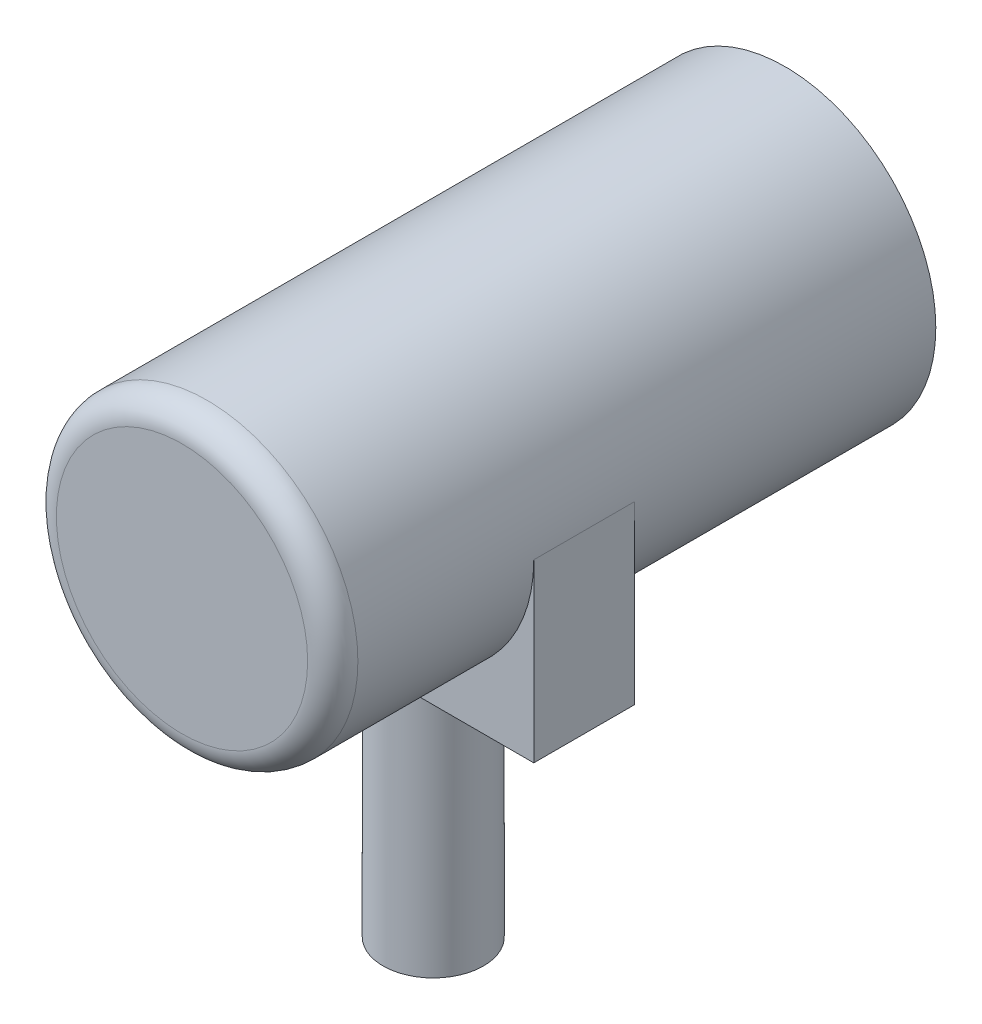
ISO-10303-21;
HEADER;
FILE_DESCRIPTION(('STEP AP214'),'2;1');
FILE_NAME('part.step','',(''),(''),'','','');
FILE_SCHEMA(('AUTOMOTIVE_DESIGN { 1 0 10303 214 1 1 1 1 }'));
ENDSEC;
DATA;
#1=APPLICATION_CONTEXT('core data for automotive mechanical design processes');
#2=APPLICATION_PROTOCOL_DEFINITION('international standard','automotive_design',2000,#1);
#3=PRODUCT_CONTEXT('',#1,'mechanical');
#4=PRODUCT('Part','Part','',(#3));
#5=PRODUCT_RELATED_PRODUCT_CATEGORY('part','',(#4));
#6=PRODUCT_DEFINITION_FORMATION('','',#4);
#7=PRODUCT_DEFINITION_CONTEXT('part definition',#1,'design');
#8=PRODUCT_DEFINITION('design','',#6,#7);
#9=PRODUCT_DEFINITION_SHAPE('','',#8);
#10=(LENGTH_UNIT() NAMED_UNIT(*) SI_UNIT(.MILLI.,.METRE.));
#11=(NAMED_UNIT(*) PLANE_ANGLE_UNIT() SI_UNIT($,.RADIAN.));
#12=(NAMED_UNIT(*) SI_UNIT($,.STERADIAN.) SOLID_ANGLE_UNIT());
#13=UNCERTAINTY_MEASURE_WITH_UNIT(LENGTH_MEASURE(1.E-05),#10,'distance_accuracy_value','');
#14=(GEOMETRIC_REPRESENTATION_CONTEXT(3) GLOBAL_UNCERTAINTY_ASSIGNED_CONTEXT((#13)) GLOBAL_UNIT_ASSIGNED_CONTEXT((#10,
#11,#12)) REPRESENTATION_CONTEXT('',''));
#15=CARTESIAN_POINT('',(0.,0.,0.));
#16=DIRECTION('',(0.,0.,1.));
#17=DIRECTION('',(1.,0.,0.));
#18=AXIS2_PLACEMENT_3D('',#15,#16,#17);
#19=CARTESIAN_POINT('',(-30.,-35.,-40.));
#20=DIRECTION('',(0.,1.,0.));
#21=DIRECTION('',(0.,0.,1.));
#22=AXIS2_PLACEMENT_3D('',#19,#20,#21);
#23=PLANE('',#22);
#24=CARTESIAN_POINT('',(0.,-35.,-50.));
#25=DIRECTION('',(0.,-1.,0.));
#26=DIRECTION('',(0.,0.,-1.));
#27=AXIS2_PLACEMENT_3D('',#24,#25,#26);
#28=CIRCLE('',#27,10.);
#29=CARTESIAN_POINT('',(0.,-35.,-60.));
#30=VERTEX_POINT('',#29);
#31=CARTESIAN_POINT('',(0.,-35.,-40.));
#32=VERTEX_POINT('',#31);
#33=EDGE_CURVE('E107',#30,#32,#28,.T.);
#34=ORIENTED_EDGE('',*,*,#33,.F.);
#35=DIRECTION('',(1.,0.,0.));
#36=VECTOR('',#35,1.);
#37=CARTESIAN_POINT('',(-30.,-35.,-60.));
#38=LINE('',#37,#36);
#39=CARTESIAN_POINT('',(30.,-35.,-60.));
#40=VERTEX_POINT('',#39);
#41=EDGE_CURVE('E96',#30,#40,#38,.T.);
#42=ORIENTED_EDGE('',*,*,#41,.T.);
#43=DIRECTION('',(0.,0.,-1.));
#44=VECTOR('',#43,1.);
#45=CARTESIAN_POINT('',(30.,-35.,-40.));
#46=LINE('',#45,#44);
#47=CARTESIAN_POINT('',(30.,-35.,-40.));
#48=VERTEX_POINT('',#47);
#49=EDGE_CURVE('E142',#48,#40,#46,.T.);
#50=ORIENTED_EDGE('',*,*,#49,.F.);
#51=DIRECTION('',(1.,0.,0.));
#52=VECTOR('',#51,1.);
#53=CARTESIAN_POINT('',(-30.,-35.,-40.));
#54=LINE('',#53,#52);
#55=EDGE_CURVE('E108',#32,#48,#54,.T.);
#56=ORIENTED_EDGE('',*,*,#55,.F.);
#57=EDGE_LOOP('',(#34,#42,#50,#56));
#58=FACE_BOUND('',#57,.T.);
#59=ADVANCED_FACE('F41',(#58),#23,.F.);
#60=CARTESIAN_POINT('',(0.,0.,-120.));
#61=DIRECTION('',(0.,0.,1.));
#62=DIRECTION('',(1.,0.,0.));
#63=AXIS2_PLACEMENT_3D('',#60,#61,#62);
#64=CYLINDRICAL_SURFACE('',#63,30.);
#65=CARTESIAN_POINT('',(0.,0.,-5.));
#66=DIRECTION('',(0.,0.,1.));
#67=DIRECTION('',(1.,0.,0.));
#68=AXIS2_PLACEMENT_3D('',#65,#66,#67);
#69=CIRCLE('',#68,30.);
#70=CARTESIAN_POINT('',(30.,0.,-5.));
#71=VERTEX_POINT('',#70);
#72=EDGE_CURVE('E11',#71,#71,#69,.F.);
#73=ORIENTED_EDGE('',*,*,#72,.T.);
#74=EDGE_LOOP('',(#73));
#75=FACE_BOUND('',#74,.T.);
#76=CARTESIAN_POINT('',(0.,0.,-40.));
#77=DIRECTION('',(0.,0.,-1.));
#78=DIRECTION('',(1.,0.,0.));
#79=AXIS2_PLACEMENT_3D('',#76,#77,#78);
#80=CIRCLE('',#79,30.);
#81=CARTESIAN_POINT('',(30.,0.,-40.));
#82=VERTEX_POINT('',#81);
#83=CARTESIAN_POINT('',(-30.,0.,-40.));
#84=VERTEX_POINT('',#83);
#85=EDGE_CURVE('E125',#82,#84,#80,.T.);
#86=ORIENTED_EDGE('',*,*,#85,.F.);
#87=DIRECTION('',(0.,0.,-1.));
#88=VECTOR('',#87,1.);
#89=CARTESIAN_POINT('',(30.,0.,-40.));
#90=LINE('',#89,#88);
#91=CARTESIAN_POINT('',(30.,0.,-60.));
#92=VERTEX_POINT('',#91);
#93=EDGE_CURVE('E134',#82,#92,#90,.T.);
#94=ORIENTED_EDGE('',*,*,#93,.T.);
#95=CARTESIAN_POINT('',(0.,0.,-60.));
#96=DIRECTION('',(0.,0.,-1.));
#97=DIRECTION('',(1.,0.,0.));
#98=AXIS2_PLACEMENT_3D('',#95,#96,#97);
#99=CIRCLE('',#98,30.);
#100=CARTESIAN_POINT('',(-30.,0.,-60.));
#101=VERTEX_POINT('',#100);
#102=EDGE_CURVE('E135',#92,#101,#99,.T.);
#103=ORIENTED_EDGE('',*,*,#102,.T.);
#104=DIRECTION('',(0.,0.,-1.));
#105=VECTOR('',#104,1.);
#106=CARTESIAN_POINT('',(-30.,0.,-40.));
#107=LINE('',#106,#105);
#108=EDGE_CURVE('E65',#84,#101,#107,.T.);
#109=ORIENTED_EDGE('',*,*,#108,.F.);
#110=EDGE_LOOP('',(#86,#94,#103,#109));
#111=FACE_BOUND('',#110,.T.);
#112=CARTESIAN_POINT('',(0.,0.,-120.));
#113=DIRECTION('',(0.,0.,1.));
#114=DIRECTION('',(1.,0.,0.));
#115=AXIS2_PLACEMENT_3D('',#112,#113,#114);
#116=CIRCLE('',#115,30.);
#117=CARTESIAN_POINT('',(30.,0.,-120.));
#118=VERTEX_POINT('',#117);
#119=EDGE_CURVE('E116',#118,#118,#116,.T.);
#120=ORIENTED_EDGE('',*,*,#119,.T.);
#121=EDGE_LOOP('',(#120));
#122=FACE_BOUND('',#121,.T.);
#123=ADVANCED_FACE('F167',(#75,#111,#122),#64,.T.);
#124=CARTESIAN_POINT('',(0.,0.,-120.));
#125=DIRECTION('',(0.,0.,1.));
#126=DIRECTION('',(1.,0.,0.));
#127=AXIS2_PLACEMENT_3D('',#124,#125,#126);
#128=PLANE('',#127);
#129=CARTESIAN_POINT('',(0.,0.,-120.));
#130=DIRECTION('',(0.,0.,1.));
#131=DIRECTION('',(1.,0.,0.));
#132=AXIS2_PLACEMENT_3D('',#129,#130,#131);
#133=CIRCLE('',#132,25.);
#134=CARTESIAN_POINT('',(25.,0.,-120.));
#135=VERTEX_POINT('',#134);
#136=EDGE_CURVE('E120',#135,#135,#133,.T.);
#137=ORIENTED_EDGE('',*,*,#136,.T.);
#138=EDGE_LOOP('',(#137));
#139=FACE_BOUND('',#138,.T.);
#140=ORIENTED_EDGE('',*,*,#119,.F.);
#141=EDGE_LOOP('',(#140));
#142=FACE_BOUND('',#141,.T.);
#143=ADVANCED_FACE('F172',(#139,#142),#128,.F.);
#144=CARTESIAN_POINT('',(0.,0.,0.));
#145=DIRECTION('',(0.,0.,1.));
#146=DIRECTION('',(1.,0.,0.));
#147=AXIS2_PLACEMENT_3D('',#144,#145,#146);
#148=PLANE('',#147);
#149=CARTESIAN_POINT('',(0.,0.,0.));
#150=DIRECTION('',(0.,0.,1.));
#151=DIRECTION('',(1.,0.,0.));
#152=AXIS2_PLACEMENT_3D('',#149,#150,#151);
#153=CIRCLE('',#152,25.);
#154=CARTESIAN_POINT('',(25.,0.,0.));
#155=VERTEX_POINT('',#154);
#156=EDGE_CURVE('E50',#155,#155,#153,.T.);
#157=ORIENTED_EDGE('',*,*,#156,.T.);
#158=EDGE_LOOP('',(#157));
#159=FACE_BOUND('',#158,.T.);
#160=ADVANCED_FACE('F153',(#159),#148,.T.);
#161=CARTESIAN_POINT('',(0.,0.,-120.));
#162=DIRECTION('',(0.,0.,1.));
#163=DIRECTION('',(1.,0.,0.));
#164=AXIS2_PLACEMENT_3D('',#161,#162,#163);
#165=CYLINDRICAL_SURFACE('',#164,25.);
#166=CARTESIAN_POINT('',(0.,0.,-118.));
#167=DIRECTION('',(0.,0.,-1.));
#168=DIRECTION('',(-1.,0.,0.));
#169=AXIS2_PLACEMENT_3D('',#166,#167,#168);
#170=CIRCLE('',#169,25.);
#171=CARTESIAN_POINT('',(-25.,0.,-118.));
#172=VERTEX_POINT('',#171);
#173=EDGE_CURVE('E112',#172,#172,#170,.T.);
#174=ORIENTED_EDGE('',*,*,#173,.F.);
#175=EDGE_LOOP('',(#174));
#176=FACE_BOUND('',#175,.T.);
#177=ORIENTED_EDGE('',*,*,#136,.F.);
#178=EDGE_LOOP('',(#177));
#179=FACE_BOUND('',#178,.T.);
#180=ADVANCED_FACE('F185',(#176,#179),#165,.F.);
#181=CARTESIAN_POINT('',(-30.,0.,-40.));
#182=DIRECTION('',(1.,0.,0.));
#183=DIRECTION('',(0.,1.,0.));
#184=AXIS2_PLACEMENT_3D('',#181,#182,#183);
#185=PLANE('',#184);
#186=DIRECTION('',(0.,-1.,0.));
#187=VECTOR('',#186,1.);
#188=CARTESIAN_POINT('',(-30.,0.,-60.));
#189=LINE('',#188,#187);
#190=CARTESIAN_POINT('',(-30.,-35.,-60.));
#191=VERTEX_POINT('',#190);
#192=EDGE_CURVE('E105',#101,#191,#189,.T.);
#193=ORIENTED_EDGE('',*,*,#192,.T.);
#194=DIRECTION('',(0.,0.,-1.));
#195=VECTOR('',#194,1.);
#196=CARTESIAN_POINT('',(-30.,-35.,-40.));
#197=LINE('',#196,#195);
#198=CARTESIAN_POINT('',(-30.,-35.,-40.));
#199=VERTEX_POINT('',#198);
#200=EDGE_CURVE('E93',#199,#191,#197,.T.);
#201=ORIENTED_EDGE('',*,*,#200,.F.);
#202=DIRECTION('',(0.,-1.,0.));
#203=VECTOR('',#202,1.);
#204=CARTESIAN_POINT('',(-30.,0.,-40.));
#205=LINE('',#204,#203);
#206=EDGE_CURVE('E128',#84,#199,#205,.T.);
#207=ORIENTED_EDGE('',*,*,#206,.F.);
#208=ORIENTED_EDGE('',*,*,#108,.T.);
#209=EDGE_LOOP('',(#193,#201,#207,#208));
#210=FACE_BOUND('',#209,.T.);
#211=ADVANCED_FACE('F178',(#210),#185,.F.);
#212=EDGE_CURVE('E57',#32,#30,#28,.T.);
#213=ORIENTED_EDGE('',*,*,#212,.F.);
#214=EDGE_CURVE('E130',#199,#32,#54,.T.);
#215=ORIENTED_EDGE('',*,*,#214,.F.);
#216=ORIENTED_EDGE('',*,*,#200,.T.);
#217=EDGE_CURVE('E89',#191,#30,#38,.T.);
#218=ORIENTED_EDGE('',*,*,#217,.T.);
#219=EDGE_LOOP('',(#213,#215,#216,#218));
#220=FACE_BOUND('',#219,.T.);
#221=ADVANCED_FACE('F91',(#220),#23,.F.);
#222=CARTESIAN_POINT('',(30.,-35.,-40.));
#223=DIRECTION('',(-1.,0.,0.));
#224=DIRECTION('',(0.,-1.,0.));
#225=AXIS2_PLACEMENT_3D('',#222,#223,#224);
#226=PLANE('',#225);
#227=DIRECTION('',(0.,1.,0.));
#228=VECTOR('',#227,1.);
#229=CARTESIAN_POINT('',(30.,-35.,-60.));
#230=LINE('',#229,#228);
#231=EDGE_CURVE('E95',#40,#92,#230,.T.);
#232=ORIENTED_EDGE('',*,*,#231,.T.);
#233=ORIENTED_EDGE('',*,*,#93,.F.);
#234=DIRECTION('',(0.,1.,0.));
#235=VECTOR('',#234,1.);
#236=CARTESIAN_POINT('',(30.,-35.,-40.));
#237=LINE('',#236,#235);
#238=EDGE_CURVE('E132',#48,#82,#237,.T.);
#239=ORIENTED_EDGE('',*,*,#238,.F.);
#240=ORIENTED_EDGE('',*,*,#49,.T.);
#241=EDGE_LOOP('',(#232,#233,#239,#240));
#242=FACE_BOUND('',#241,.T.);
#243=ADVANCED_FACE('F177',(#242),#226,.F.);
#244=CARTESIAN_POINT('',(0.,0.,-40.));
#245=DIRECTION('',(0.,0.,1.));
#246=DIRECTION('',(1.,0.,0.));
#247=AXIS2_PLACEMENT_3D('',#244,#245,#246);
#248=PLANE('',#247);
#249=ORIENTED_EDGE('',*,*,#85,.T.);
#250=ORIENTED_EDGE('',*,*,#206,.T.);
#251=ORIENTED_EDGE('',*,*,#214,.T.);
#252=ORIENTED_EDGE('',*,*,#55,.T.);
#253=ORIENTED_EDGE('',*,*,#238,.T.);
#254=EDGE_LOOP('',(#249,#250,#251,#252,#253));
#255=FACE_BOUND('',#254,.T.);
#256=ADVANCED_FACE('F183',(#255),#248,.T.);
#257=CARTESIAN_POINT('',(0.,0.,-60.));
#258=DIRECTION('',(0.,0.,1.));
#259=DIRECTION('',(1.,0.,0.));
#260=AXIS2_PLACEMENT_3D('',#257,#258,#259);
#261=PLANE('',#260);
#262=ORIENTED_EDGE('',*,*,#102,.F.);
#263=ORIENTED_EDGE('',*,*,#231,.F.);
#264=ORIENTED_EDGE('',*,*,#41,.F.);
#265=ORIENTED_EDGE('',*,*,#217,.F.);
#266=ORIENTED_EDGE('',*,*,#192,.F.);
#267=EDGE_LOOP('',(#262,#263,#264,#265,#266));
#268=FACE_BOUND('',#267,.T.);
#269=ADVANCED_FACE('F101',(#268),#261,.F.);
#270=CARTESIAN_POINT('',(0.,-85.,-50.));
#271=DIRECTION('',(0.,1.,0.));
#272=DIRECTION('',(0.,0.,1.));
#273=AXIS2_PLACEMENT_3D('',#270,#271,#272);
#274=CYLINDRICAL_SURFACE('',#273,10.);
#275=CARTESIAN_POINT('',(0.,-85.,-50.));
#276=DIRECTION('',(0.,-1.,0.));
#277=DIRECTION('',(0.,0.,-1.));
#278=AXIS2_PLACEMENT_3D('',#275,#276,#277);
#279=CIRCLE('',#278,10.);
#280=CARTESIAN_POINT('',(0.,-85.,-60.));
#281=VERTEX_POINT('',#280);
#282=EDGE_CURVE('E111',#281,#281,#279,.T.);
#283=ORIENTED_EDGE('',*,*,#282,.F.);
#284=EDGE_LOOP('',(#283));
#285=FACE_BOUND('',#284,.T.);
#286=ORIENTED_EDGE('',*,*,#33,.T.);
#287=ORIENTED_EDGE('',*,*,#212,.T.);
#288=EDGE_LOOP('',(#286,#287));
#289=FACE_BOUND('',#288,.T.);
#290=ADVANCED_FACE('F114',(#285,#289),#274,.T.);
#291=CARTESIAN_POINT('',(0.,-85.,-50.));
#292=DIRECTION('',(0.,-1.,0.));
#293=DIRECTION('',(0.,0.,-1.));
#294=AXIS2_PLACEMENT_3D('',#291,#292,#293);
#295=PLANE('',#294);
#296=ORIENTED_EDGE('',*,*,#282,.T.);
#297=EDGE_LOOP('',(#296));
#298=FACE_BOUND('',#297,.T.);
#299=ADVANCED_FACE('F162',(#298),#295,.T.);
#300=CARTESIAN_POINT('',(0.,0.,-118.));
#301=DIRECTION('',(0.,0.,-1.));
#302=DIRECTION('',(-1.,0.,0.));
#303=AXIS2_PLACEMENT_3D('',#300,#301,#302);
#304=PLANE('',#303);
#305=ORIENTED_EDGE('',*,*,#173,.T.);
#306=EDGE_LOOP('',(#305));
#307=FACE_BOUND('',#306,.T.);
#308=ADVANCED_FACE('F156',(#307),#304,.T.);
#309=CARTESIAN_POINT('',(0.,0.,-5.));
#310=DIRECTION('',(0.,0.,1.));
#311=DIRECTION('',(1.,0.,0.));
#312=AXIS2_PLACEMENT_3D('',#309,#310,#311);
#313=TOROIDAL_SURFACE('',#312,25.,5.);
#314=ORIENTED_EDGE('',*,*,#72,.F.);
#315=EDGE_LOOP('',(#314));
#316=FACE_BOUND('',#315,.T.);
#317=ORIENTED_EDGE('',*,*,#156,.F.);
#318=EDGE_LOOP('',(#317));
#319=FACE_BOUND('',#318,.T.);
#320=ADVANCED_FACE('F43',(#316,#319),#313,.T.);
#321=CLOSED_SHELL('',(#59,#123,#143,#160,#180,#211,#221,#243,#256,#269,#290,#299,#308,#320));
#322=CARTESIAN_POINT('',(0.,0.,-116.));
#323=DIRECTION('',(0.,0.,-1.));
#324=DIRECTION('',(-1.,0.,0.));
#325=AXIS2_PLACEMENT_3D('',#322,#323,#324);
#326=PLANE('',#325);
#327=CARTESIAN_POINT('',(0.,0.,-116.));
#328=DIRECTION('',(0.,0.,-1.));
#329=DIRECTION('',(-1.,0.,0.));
#330=AXIS2_PLACEMENT_3D('',#327,#328,#329);
#331=CIRCLE('',#330,25.);
#332=CARTESIAN_POINT('',(-25.,0.,-116.));
#333=VERTEX_POINT('',#332);
#334=EDGE_CURVE('E115',#333,#333,#331,.F.);
#335=ORIENTED_EDGE('',*,*,#334,.T.);
#336=EDGE_LOOP('',(#335));
#337=FACE_BOUND('',#336,.T.);
#338=ADVANCED_FACE('F196',(#337),#326,.F.);
#339=CARTESIAN_POINT('',(0.,0.,-5.));
#340=DIRECTION('',(0.,0.,1.));
#341=DIRECTION('',(1.,0.,0.));
#342=AXIS2_PLACEMENT_3D('',#339,#340,#341);
#343=PLANE('',#342);
#344=CARTESIAN_POINT('',(0.,0.,-5.));
#345=DIRECTION('',(0.,0.,1.));
#346=DIRECTION('',(1.,0.,0.));
#347=AXIS2_PLACEMENT_3D('',#344,#345,#346);
#348=CIRCLE('',#347,25.);
#349=CARTESIAN_POINT('',(25.,0.,-5.));
#350=VERTEX_POINT('',#349);
#351=EDGE_CURVE('E146',#350,#350,#348,.T.);
#352=ORIENTED_EDGE('',*,*,#351,.F.);
#353=EDGE_LOOP('',(#352));
#354=FACE_BOUND('',#353,.T.);
#355=ADVANCED_FACE('F193',(#354),#343,.F.);
#356=ORIENTED_EDGE('',*,*,#351,.T.);
#357=EDGE_LOOP('',(#356));
#358=FACE_BOUND('',#357,.T.);
#359=ORIENTED_EDGE('',*,*,#334,.F.);
#360=EDGE_LOOP('',(#359));
#361=FACE_BOUND('',#360,.T.);
#362=ADVANCED_FACE('F191',(#358,#361),#165,.F.);
#363=CLOSED_SHELL('',(#338,#355,#362));
#364=ORIENTED_CLOSED_SHELL('',*,#363,.T.);
#365=BREP_WITH_VOIDS('B2',#321,(#364));
#366=ADVANCED_BREP_SHAPE_REPRESENTATION('',(#18,#365),#14);
#367=SHAPE_DEFINITION_REPRESENTATION(#9,#366);
ENDSEC;
END-ISO-10303-21;
